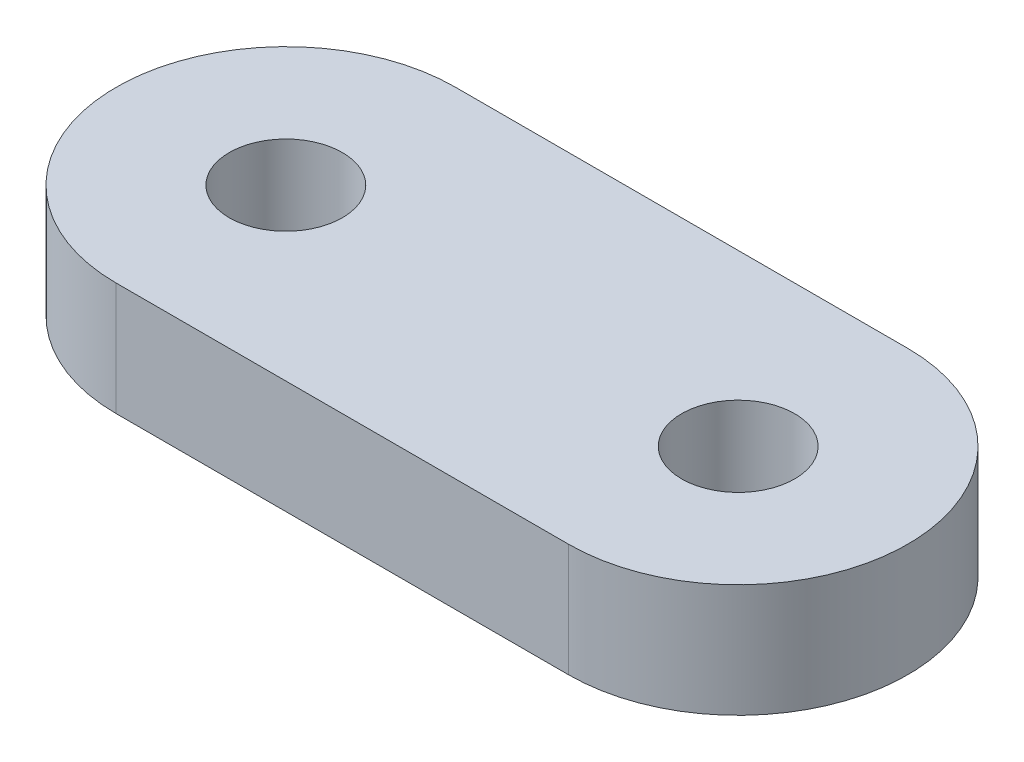
ISO-10303-21;
HEADER;
FILE_DESCRIPTION(('STEP AP214'),'2;1');
FILE_NAME('part.step','',(''),(''),'','','');
FILE_SCHEMA(('AUTOMOTIVE_DESIGN { 1 0 10303 214 1 1 1 1 }'));
ENDSEC;
DATA;
#1=APPLICATION_CONTEXT('core data for automotive mechanical design processes');
#2=APPLICATION_PROTOCOL_DEFINITION('international standard','automotive_design',2000,#1);
#3=PRODUCT_CONTEXT('',#1,'mechanical');
#4=PRODUCT('Part','Part','',(#3));
#5=PRODUCT_RELATED_PRODUCT_CATEGORY('part','',(#4));
#6=PRODUCT_DEFINITION_FORMATION('','',#4);
#7=PRODUCT_DEFINITION_CONTEXT('part definition',#1,'design');
#8=PRODUCT_DEFINITION('design','',#6,#7);
#9=PRODUCT_DEFINITION_SHAPE('','',#8);
#10=(LENGTH_UNIT() NAMED_UNIT(*) SI_UNIT(.MILLI.,.METRE.));
#11=(NAMED_UNIT(*) PLANE_ANGLE_UNIT() SI_UNIT($,.RADIAN.));
#12=(NAMED_UNIT(*) SI_UNIT($,.STERADIAN.) SOLID_ANGLE_UNIT());
#13=UNCERTAINTY_MEASURE_WITH_UNIT(LENGTH_MEASURE(1.E-05),#10,'distance_accuracy_value','');
#14=(GEOMETRIC_REPRESENTATION_CONTEXT(3) GLOBAL_UNCERTAINTY_ASSIGNED_CONTEXT((#13)) GLOBAL_UNIT_ASSIGNED_CONTEXT((#10,
#11,#12)) REPRESENTATION_CONTEXT('',''));
#15=CARTESIAN_POINT('',(0.,0.,0.));
#16=DIRECTION('',(0.,0.,1.));
#17=DIRECTION('',(1.,0.,0.));
#18=AXIS2_PLACEMENT_3D('',#15,#16,#17);
#19=CARTESIAN_POINT('',(0.,1.,0.));
#20=DIRECTION('',(0.,1.,0.));
#21=DIRECTION('',(0.,0.,1.));
#22=AXIS2_PLACEMENT_3D('',#19,#20,#21);
#23=PLANE('',#22);
#24=CARTESIAN_POINT('',(-4.,1.,0.));
#25=DIRECTION('',(0.,1.,0.));
#26=DIRECTION('',(0.,0.,1.));
#27=AXIS2_PLACEMENT_3D('',#24,#25,#26);
#28=CIRCLE('',#27,0.500000000000001);
#29=CARTESIAN_POINT('',(-4.,1.,0.500000000000001));
#30=VERTEX_POINT('',#29);
#31=EDGE_CURVE('E104',#30,#30,#28,.T.);
#32=ORIENTED_EDGE('',*,*,#31,.F.);
#33=EDGE_LOOP('',(#32));
#34=FACE_BOUND('',#33,.T.);
#35=CARTESIAN_POINT('',(0.,1.,0.));
#36=DIRECTION('',(0.,1.,0.));
#37=DIRECTION('',(0.,0.,1.));
#38=AXIS2_PLACEMENT_3D('',#35,#36,#37);
#39=CIRCLE('',#38,1.5);
#40=CARTESIAN_POINT('',(0.,1.,1.5));
#41=VERTEX_POINT('',#40);
#42=CARTESIAN_POINT('',(0.,1.,-1.5));
#43=VERTEX_POINT('',#42);
#44=EDGE_CURVE('E89',#41,#43,#39,.T.);
#45=ORIENTED_EDGE('',*,*,#44,.T.);
#46=DIRECTION('',(-1.,0.,0.));
#47=VECTOR('',#46,1.);
#48=CARTESIAN_POINT('',(0.,1.,-1.5));
#49=LINE('',#48,#47);
#50=CARTESIAN_POINT('',(-4.,1.,-1.5));
#51=VERTEX_POINT('',#50);
#52=EDGE_CURVE('E84',#43,#51,#49,.T.);
#53=ORIENTED_EDGE('',*,*,#52,.T.);
#54=CARTESIAN_POINT('',(-4.,1.,0.));
#55=DIRECTION('',(0.,1.,0.));
#56=DIRECTION('',(0.,0.,1.));
#57=AXIS2_PLACEMENT_3D('',#54,#55,#56);
#58=CIRCLE('',#57,1.5);
#59=CARTESIAN_POINT('',(-4.,1.,1.5));
#60=VERTEX_POINT('',#59);
#61=EDGE_CURVE('E87',#51,#60,#58,.T.);
#62=ORIENTED_EDGE('',*,*,#61,.T.);
#63=DIRECTION('',(1.,0.,0.));
#64=VECTOR('',#63,1.);
#65=CARTESIAN_POINT('',(0.,1.,1.5));
#66=LINE('',#65,#64);
#67=EDGE_CURVE('E54',#60,#41,#66,.T.);
#68=ORIENTED_EDGE('',*,*,#67,.T.);
#69=EDGE_LOOP('',(#45,#53,#62,#68));
#70=FACE_BOUND('',#69,.T.);
#71=CARTESIAN_POINT('',(0.,1.,0.));
#72=DIRECTION('',(0.,1.,0.));
#73=DIRECTION('',(0.,0.,1.));
#74=AXIS2_PLACEMENT_3D('',#71,#72,#73);
#75=CIRCLE('',#74,0.5);
#76=CARTESIAN_POINT('',(0.,1.,0.5));
#77=VERTEX_POINT('',#76);
#78=EDGE_CURVE('E119',#77,#77,#75,.T.);
#79=ORIENTED_EDGE('',*,*,#78,.F.);
#80=EDGE_LOOP('',(#79));
#81=FACE_BOUND('',#80,.T.);
#82=ADVANCED_FACE('F37',(#34,#70,#81),#23,.T.);
#83=CARTESIAN_POINT('',(0.,0.,0.));
#84=DIRECTION('',(0.,1.,0.));
#85=DIRECTION('',(0.,0.,1.));
#86=AXIS2_PLACEMENT_3D('',#83,#84,#85);
#87=PLANE('',#86);
#88=CARTESIAN_POINT('',(0.,0.,0.));
#89=DIRECTION('',(0.,1.,0.));
#90=DIRECTION('',(0.,0.,1.));
#91=AXIS2_PLACEMENT_3D('',#88,#89,#90);
#92=CIRCLE('',#91,1.5);
#93=CARTESIAN_POINT('',(0.,0.,1.5));
#94=VERTEX_POINT('',#93);
#95=CARTESIAN_POINT('',(0.,0.,-1.5));
#96=VERTEX_POINT('',#95);
#97=EDGE_CURVE('E101',#94,#96,#92,.T.);
#98=ORIENTED_EDGE('',*,*,#97,.F.);
#99=DIRECTION('',(1.,0.,0.));
#100=VECTOR('',#99,1.);
#101=CARTESIAN_POINT('',(0.,0.,1.5));
#102=LINE('',#101,#100);
#103=CARTESIAN_POINT('',(-4.,0.,1.5));
#104=VERTEX_POINT('',#103);
#105=EDGE_CURVE('E77',#104,#94,#102,.T.);
#106=ORIENTED_EDGE('',*,*,#105,.F.);
#107=CARTESIAN_POINT('',(-4.,0.,0.));
#108=DIRECTION('',(0.,1.,0.));
#109=DIRECTION('',(0.,0.,1.));
#110=AXIS2_PLACEMENT_3D('',#107,#108,#109);
#111=CIRCLE('',#110,1.5);
#112=CARTESIAN_POINT('',(-4.,0.,-1.5));
#113=VERTEX_POINT('',#112);
#114=EDGE_CURVE('E71',#113,#104,#111,.T.);
#115=ORIENTED_EDGE('',*,*,#114,.F.);
#116=DIRECTION('',(-1.,0.,0.));
#117=VECTOR('',#116,1.);
#118=CARTESIAN_POINT('',(0.,0.,-1.5));
#119=LINE('',#118,#117);
#120=EDGE_CURVE('E93',#96,#113,#119,.T.);
#121=ORIENTED_EDGE('',*,*,#120,.F.);
#122=EDGE_LOOP('',(#98,#106,#115,#121));
#123=FACE_BOUND('',#122,.T.);
#124=CARTESIAN_POINT('',(-4.,0.,0.));
#125=DIRECTION('',(0.,1.,0.));
#126=DIRECTION('',(0.,0.,1.));
#127=AXIS2_PLACEMENT_3D('',#124,#125,#126);
#128=CIRCLE('',#127,0.500000000000001);
#129=CARTESIAN_POINT('',(-4.,0.,0.500000000000001));
#130=VERTEX_POINT('',#129);
#131=EDGE_CURVE('E116',#130,#130,#128,.T.);
#132=ORIENTED_EDGE('',*,*,#131,.T.);
#133=EDGE_LOOP('',(#132));
#134=FACE_BOUND('',#133,.T.);
#135=CARTESIAN_POINT('',(0.,0.,0.));
#136=DIRECTION('',(0.,1.,0.));
#137=DIRECTION('',(0.,0.,1.));
#138=AXIS2_PLACEMENT_3D('',#135,#136,#137);
#139=CIRCLE('',#138,0.5);
#140=CARTESIAN_POINT('',(0.,0.,0.5));
#141=VERTEX_POINT('',#140);
#142=EDGE_CURVE('E122',#141,#141,#139,.T.);
#143=ORIENTED_EDGE('',*,*,#142,.T.);
#144=EDGE_LOOP('',(#143));
#145=FACE_BOUND('',#144,.T.);
#146=ADVANCED_FACE('F112',(#123,#134,#145),#87,.F.);
#147=CARTESIAN_POINT('',(0.,1.,0.));
#148=DIRECTION('',(0.,-1.,0.));
#149=DIRECTION('',(0.,0.,-1.));
#150=AXIS2_PLACEMENT_3D('',#147,#148,#149);
#151=CYLINDRICAL_SURFACE('',#150,1.5);
#152=ORIENTED_EDGE('',*,*,#97,.T.);
#153=DIRECTION('',(0.,-1.,0.));
#154=VECTOR('',#153,1.);
#155=CARTESIAN_POINT('',(0.,1.,-1.5));
#156=LINE('',#155,#154);
#157=EDGE_CURVE('E11',#43,#96,#156,.T.);
#158=ORIENTED_EDGE('',*,*,#157,.F.);
#159=ORIENTED_EDGE('',*,*,#44,.F.);
#160=DIRECTION('',(0.,-1.,0.));
#161=VECTOR('',#160,1.);
#162=CARTESIAN_POINT('',(0.,1.,1.5));
#163=LINE('',#162,#161);
#164=EDGE_CURVE('E97',#41,#94,#163,.T.);
#165=ORIENTED_EDGE('',*,*,#164,.T.);
#166=EDGE_LOOP('',(#152,#158,#159,#165));
#167=FACE_BOUND('',#166,.T.);
#168=ADVANCED_FACE('F39',(#167),#151,.T.);
#169=CARTESIAN_POINT('',(0.,1.,-1.5));
#170=DIRECTION('',(0.,0.,1.));
#171=DIRECTION('',(1.,0.,0.));
#172=AXIS2_PLACEMENT_3D('',#169,#170,#171);
#173=PLANE('',#172);
#174=ORIENTED_EDGE('',*,*,#120,.T.);
#175=DIRECTION('',(0.,-1.,0.));
#176=VECTOR('',#175,1.);
#177=CARTESIAN_POINT('',(-4.,1.,-1.5));
#178=LINE('',#177,#176);
#179=EDGE_CURVE('E46',#51,#113,#178,.T.);
#180=ORIENTED_EDGE('',*,*,#179,.F.);
#181=ORIENTED_EDGE('',*,*,#52,.F.);
#182=ORIENTED_EDGE('',*,*,#157,.T.);
#183=EDGE_LOOP('',(#174,#180,#181,#182));
#184=FACE_BOUND('',#183,.T.);
#185=ADVANCED_FACE('F92',(#184),#173,.F.);
#186=CARTESIAN_POINT('',(-4.,1.,0.));
#187=DIRECTION('',(0.,-1.,0.));
#188=DIRECTION('',(0.,0.,-1.));
#189=AXIS2_PLACEMENT_3D('',#186,#187,#188);
#190=CYLINDRICAL_SURFACE('',#189,1.5);
#191=ORIENTED_EDGE('',*,*,#114,.T.);
#192=DIRECTION('',(0.,-1.,0.));
#193=VECTOR('',#192,1.);
#194=CARTESIAN_POINT('',(-4.,1.,1.5));
#195=LINE('',#194,#193);
#196=EDGE_CURVE('E94',#60,#104,#195,.T.);
#197=ORIENTED_EDGE('',*,*,#196,.F.);
#198=ORIENTED_EDGE('',*,*,#61,.F.);
#199=ORIENTED_EDGE('',*,*,#179,.T.);
#200=EDGE_LOOP('',(#191,#197,#198,#199));
#201=FACE_BOUND('',#200,.T.);
#202=ADVANCED_FACE('F95',(#201),#190,.T.);
#203=CARTESIAN_POINT('',(0.,1.,1.5));
#204=DIRECTION('',(0.,0.,-1.));
#205=DIRECTION('',(-1.,0.,0.));
#206=AXIS2_PLACEMENT_3D('',#203,#204,#205);
#207=PLANE('',#206);
#208=ORIENTED_EDGE('',*,*,#105,.T.);
#209=ORIENTED_EDGE('',*,*,#164,.F.);
#210=ORIENTED_EDGE('',*,*,#67,.F.);
#211=ORIENTED_EDGE('',*,*,#196,.T.);
#212=EDGE_LOOP('',(#208,#209,#210,#211));
#213=FACE_BOUND('',#212,.T.);
#214=ADVANCED_FACE('F109',(#213),#207,.F.);
#215=CARTESIAN_POINT('',(-4.,1.,0.));
#216=DIRECTION('',(0.,-1.,0.));
#217=DIRECTION('',(0.,0.,-1.));
#218=AXIS2_PLACEMENT_3D('',#215,#216,#217);
#219=CYLINDRICAL_SURFACE('',#218,0.500000000000001);
#220=ORIENTED_EDGE('',*,*,#31,.T.);
#221=EDGE_LOOP('',(#220));
#222=FACE_BOUND('',#221,.T.);
#223=ORIENTED_EDGE('',*,*,#131,.F.);
#224=EDGE_LOOP('',(#223));
#225=FACE_BOUND('',#224,.T.);
#226=ADVANCED_FACE('F139',(#222,#225),#219,.F.);
#227=CARTESIAN_POINT('',(0.,1.,0.));
#228=DIRECTION('',(0.,-1.,0.));
#229=DIRECTION('',(0.,0.,-1.));
#230=AXIS2_PLACEMENT_3D('',#227,#228,#229);
#231=CYLINDRICAL_SURFACE('',#230,0.5);
#232=ORIENTED_EDGE('',*,*,#78,.T.);
#233=EDGE_LOOP('',(#232));
#234=FACE_BOUND('',#233,.T.);
#235=ORIENTED_EDGE('',*,*,#142,.F.);
#236=EDGE_LOOP('',(#235));
#237=FACE_BOUND('',#236,.T.);
#238=ADVANCED_FACE('F128',(#234,#237),#231,.F.);
#239=CLOSED_SHELL('',(#82,#146,#168,#185,#202,#214,#226,#238));
#240=MANIFOLD_SOLID_BREP('B2',#239);
#241=ADVANCED_BREP_SHAPE_REPRESENTATION('',(#18,#240),#14);
#242=SHAPE_DEFINITION_REPRESENTATION(#9,#241);
ENDSEC;
END-ISO-10303-21;
